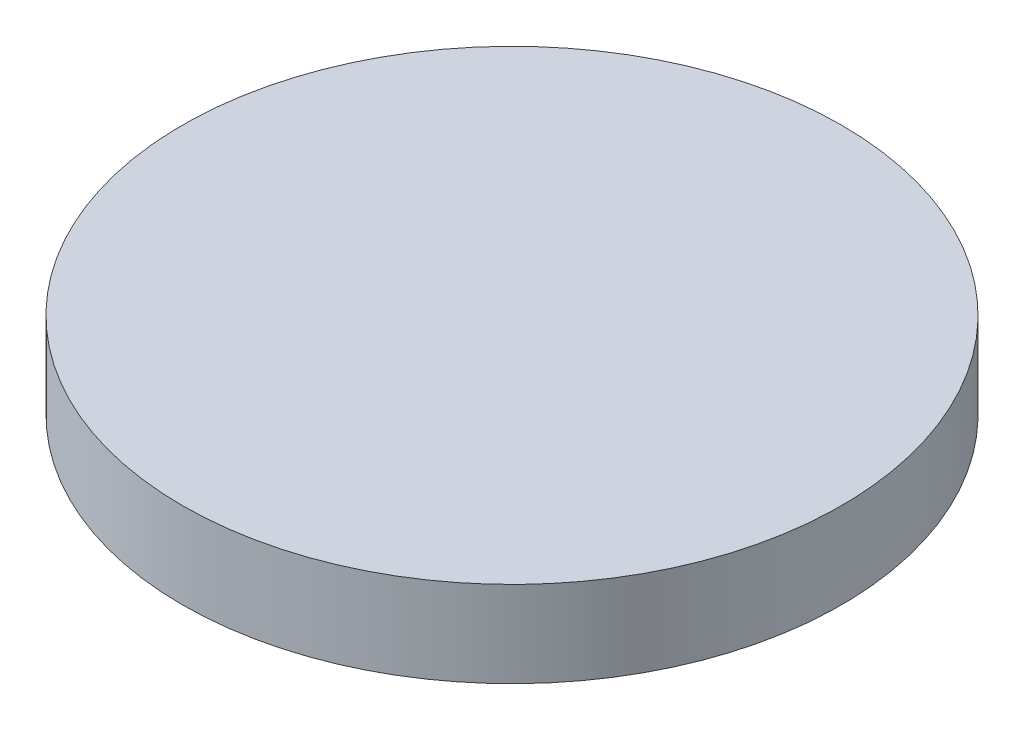
ISO-10303-21;
HEADER;
FILE_DESCRIPTION(('STEP AP214'),'2;1');
FILE_NAME('part.step','',(''),(''),'','','');
FILE_SCHEMA(('AUTOMOTIVE_DESIGN { 1 0 10303 214 1 1 1 1 }'));
ENDSEC;
DATA;
#1=APPLICATION_CONTEXT('core data for automotive mechanical design processes');
#2=APPLICATION_PROTOCOL_DEFINITION('international standard','automotive_design',2000,#1);
#3=PRODUCT_CONTEXT('',#1,'mechanical');
#4=PRODUCT('Part','Part','',(#3));
#5=PRODUCT_RELATED_PRODUCT_CATEGORY('part','',(#4));
#6=PRODUCT_DEFINITION_FORMATION('','',#4);
#7=PRODUCT_DEFINITION_CONTEXT('part definition',#1,'design');
#8=PRODUCT_DEFINITION('design','',#6,#7);
#9=PRODUCT_DEFINITION_SHAPE('','',#8);
#10=(LENGTH_UNIT() NAMED_UNIT(*) SI_UNIT(.MILLI.,.METRE.));
#11=(NAMED_UNIT(*) PLANE_ANGLE_UNIT() SI_UNIT($,.RADIAN.));
#12=(NAMED_UNIT(*) SI_UNIT($,.STERADIAN.) SOLID_ANGLE_UNIT());
#13=UNCERTAINTY_MEASURE_WITH_UNIT(LENGTH_MEASURE(1.E-05),#10,'distance_accuracy_value','');
#14=(GEOMETRIC_REPRESENTATION_CONTEXT(3) GLOBAL_UNCERTAINTY_ASSIGNED_CONTEXT((#13)) GLOBAL_UNIT_ASSIGNED_CONTEXT((#10,
#11,#12)) REPRESENTATION_CONTEXT('',''));
#15=CARTESIAN_POINT('',(0.,0.,0.));
#16=DIRECTION('',(0.,0.,1.));
#17=DIRECTION('',(1.,0.,0.));
#18=AXIS2_PLACEMENT_3D('',#15,#16,#17);
#19=CARTESIAN_POINT('',(0.,1.5,0.));
#20=DIRECTION('',(0.,-1.,0.));
#21=DIRECTION('',(0.,0.,-1.));
#22=AXIS2_PLACEMENT_3D('',#19,#20,#21);
#23=CYLINDRICAL_SURFACE('',#22,11.5);
#24=CARTESIAN_POINT('',(0.,1.5,0.));
#25=DIRECTION('',(0.,1.,0.));
#26=DIRECTION('',(0.,0.,1.));
#27=AXIS2_PLACEMENT_3D('',#24,#25,#26);
#28=CIRCLE('',#27,11.5);
#29=CARTESIAN_POINT('',(0.,1.5,11.5));
#30=VERTEX_POINT('',#29);
#31=EDGE_CURVE('E10',#30,#30,#28,.T.);
#32=ORIENTED_EDGE('',*,*,#31,.F.);
#33=EDGE_LOOP('',(#32));
#34=FACE_BOUND('',#33,.T.);
#35=CARTESIAN_POINT('',(0.,-1.5,0.));
#36=DIRECTION('',(0.,1.,0.));
#37=DIRECTION('',(0.,0.,1.));
#38=AXIS2_PLACEMENT_3D('',#35,#36,#37);
#39=CIRCLE('',#38,11.5);
#40=CARTESIAN_POINT('',(0.,-1.5,11.5));
#41=VERTEX_POINT('',#40);
#42=EDGE_CURVE('E37',#41,#41,#39,.T.);
#43=ORIENTED_EDGE('',*,*,#42,.T.);
#44=EDGE_LOOP('',(#43));
#45=FACE_BOUND('',#44,.T.);
#46=ADVANCED_FACE('F34',(#34,#45),#23,.T.);
#47=CARTESIAN_POINT('',(0.,1.5,0.));
#48=DIRECTION('',(0.,1.,0.));
#49=DIRECTION('',(0.,0.,1.));
#50=AXIS2_PLACEMENT_3D('',#47,#48,#49);
#51=PLANE('',#50);
#52=ORIENTED_EDGE('',*,*,#31,.T.);
#53=EDGE_LOOP('',(#52));
#54=FACE_BOUND('',#53,.T.);
#55=ADVANCED_FACE('F49',(#54),#51,.T.);
#56=CARTESIAN_POINT('',(0.,-1.5,0.));
#57=DIRECTION('',(0.,1.,0.));
#58=DIRECTION('',(0.,0.,1.));
#59=AXIS2_PLACEMENT_3D('',#56,#57,#58);
#60=PLANE('',#59);
#61=ORIENTED_EDGE('',*,*,#42,.F.);
#62=EDGE_LOOP('',(#61));
#63=FACE_BOUND('',#62,.T.);
#64=ADVANCED_FACE('F47',(#63),#60,.F.);
#65=CLOSED_SHELL('',(#46,#55,#64));
#66=MANIFOLD_SOLID_BREP('B2',#65);
#67=ADVANCED_BREP_SHAPE_REPRESENTATION('',(#18,#66),#14);
#68=SHAPE_DEFINITION_REPRESENTATION(#9,#67);
ENDSEC;
END-ISO-10303-21;
